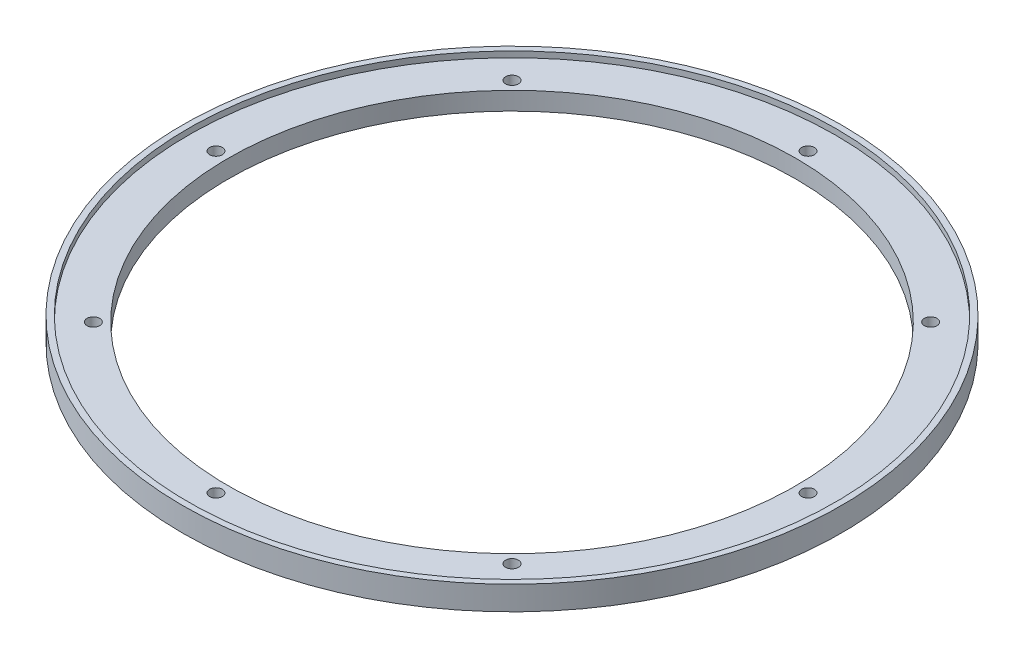
ISO-10303-21;
HEADER;
FILE_DESCRIPTION(('STEP AP214'),'2;1');
FILE_NAME('part.step','',(''),(''),'','','');
FILE_SCHEMA(('AUTOMOTIVE_DESIGN { 1 0 10303 214 1 1 1 1 }'));
ENDSEC;
DATA;
#1=APPLICATION_CONTEXT('core data for automotive mechanical design processes');
#2=APPLICATION_PROTOCOL_DEFINITION('international standard','automotive_design',2000,#1);
#3=PRODUCT_CONTEXT('',#1,'mechanical');
#4=PRODUCT('Part','Part','',(#3));
#5=PRODUCT_RELATED_PRODUCT_CATEGORY('part','',(#4));
#6=PRODUCT_DEFINITION_FORMATION('','',#4);
#7=PRODUCT_DEFINITION_CONTEXT('part definition',#1,'design');
#8=PRODUCT_DEFINITION('design','',#6,#7);
#9=PRODUCT_DEFINITION_SHAPE('','',#8);
#10=(LENGTH_UNIT() NAMED_UNIT(*) SI_UNIT(.MILLI.,.METRE.));
#11=(NAMED_UNIT(*) PLANE_ANGLE_UNIT() SI_UNIT($,.RADIAN.));
#12=(NAMED_UNIT(*) SI_UNIT($,.STERADIAN.) SOLID_ANGLE_UNIT());
#13=UNCERTAINTY_MEASURE_WITH_UNIT(LENGTH_MEASURE(1.E-05),#10,'distance_accuracy_value','');
#14=(GEOMETRIC_REPRESENTATION_CONTEXT(3) GLOBAL_UNCERTAINTY_ASSIGNED_CONTEXT((#13)) GLOBAL_UNIT_ASSIGNED_CONTEXT((#10,
#11,#12)) REPRESENTATION_CONTEXT('',''));
#15=CARTESIAN_POINT('',(0.,0.,0.));
#16=DIRECTION('',(0.,0.,1.));
#17=DIRECTION('',(1.,0.,0.));
#18=AXIS2_PLACEMENT_3D('',#15,#16,#17);
#19=CARTESIAN_POINT('',(0.,0.,0.));
#20=DIRECTION('',(0.,-1.,0.));
#21=DIRECTION('',(0.,0.,-1.));
#22=AXIS2_PLACEMENT_3D('',#19,#20,#21);
#23=CYLINDRICAL_SURFACE('',#22,96.1);
#24=CARTESIAN_POINT('',(0.,0.,0.));
#25=DIRECTION('',(0.,-1.,0.));
#26=DIRECTION('',(0.,0.,-1.));
#27=AXIS2_PLACEMENT_3D('',#24,#25,#26);
#28=CIRCLE('',#27,96.1);
#29=CARTESIAN_POINT('',(0.,0.,-96.1));
#30=VERTEX_POINT('',#29);
#31=EDGE_CURVE('E10',#30,#30,#28,.T.);
#32=ORIENTED_EDGE('',*,*,#31,.T.);
#33=EDGE_LOOP('',(#32));
#34=FACE_BOUND('',#33,.T.);
#35=CARTESIAN_POINT('',(0.,6.1,0.));
#36=DIRECTION('',(0.,-1.,0.));
#37=DIRECTION('',(0.,0.,-1.));
#38=AXIS2_PLACEMENT_3D('',#35,#36,#37);
#39=CIRCLE('',#38,96.1);
#40=CARTESIAN_POINT('',(0.,6.1,-96.1));
#41=VERTEX_POINT('',#40);
#42=EDGE_CURVE('E60',#41,#41,#39,.T.);
#43=ORIENTED_EDGE('',*,*,#42,.F.);
#44=EDGE_LOOP('',(#43));
#45=FACE_BOUND('',#44,.T.);
#46=ADVANCED_FACE('F38',(#34,#45),#23,.F.);
#47=CARTESIAN_POINT('',(96.1,0.,0.));
#48=DIRECTION('',(0.,-1.,0.));
#49=DIRECTION('',(0.,0.,-1.));
#50=AXIS2_PLACEMENT_3D('',#47,#48,#49);
#51=PLANE('',#50);
#52=CARTESIAN_POINT('',(-100.25,0.,0.));
#53=DIRECTION('',(0.,-1.,0.));
#54=DIRECTION('',(0.,0.,-1.));
#55=AXIS2_PLACEMENT_3D('',#52,#53,#54);
#56=CIRCLE('',#55,2.15);
#57=CARTESIAN_POINT('',(-100.25,0.,-2.15));
#58=VERTEX_POINT('',#57);
#59=EDGE_CURVE('E106',#58,#58,#56,.F.);
#60=ORIENTED_EDGE('',*,*,#59,.T.);
#61=EDGE_LOOP('',(#60));
#62=FACE_BOUND('',#61,.T.);
#63=CARTESIAN_POINT('',(-70.8874548139513,0.,-70.8874548139515));
#64=DIRECTION('',(0.,-1.,0.));
#65=DIRECTION('',(0.,0.,-1.));
#66=AXIS2_PLACEMENT_3D('',#63,#64,#65);
#67=CIRCLE('',#66,2.15);
#68=CARTESIAN_POINT('',(-70.8874548139513,0.,-73.0374548139515));
#69=VERTEX_POINT('',#68);
#70=EDGE_CURVE('E103',#69,#69,#67,.F.);
#71=ORIENTED_EDGE('',*,*,#70,.T.);
#72=EDGE_LOOP('',(#71));
#73=FACE_BOUND('',#72,.T.);
#74=CARTESIAN_POINT('',(3.26928365306821E-13,0.,-100.25));
#75=DIRECTION('',(0.,-1.,0.));
#76=DIRECTION('',(0.,0.,-1.));
#77=AXIS2_PLACEMENT_3D('',#74,#75,#76);
#78=CIRCLE('',#77,2.15);
#79=CARTESIAN_POINT('',(3.26928365306821E-13,0.,-102.4));
#80=VERTEX_POINT('',#79);
#81=EDGE_CURVE('E97',#80,#80,#78,.F.);
#82=ORIENTED_EDGE('',*,*,#81,.T.);
#83=EDGE_LOOP('',(#82));
#84=FACE_BOUND('',#83,.T.);
#85=CARTESIAN_POINT('',(70.8874548139518,0.,-70.8874548139514));
#86=DIRECTION('',(0.,-1.,0.));
#87=DIRECTION('',(0.,0.,-1.));
#88=AXIS2_PLACEMENT_3D('',#85,#86,#87);
#89=CIRCLE('',#88,2.15);
#90=CARTESIAN_POINT('',(70.8874548139518,0.,-73.0374548139514));
#91=VERTEX_POINT('',#90);
#92=EDGE_CURVE('E91',#91,#91,#89,.F.);
#93=ORIENTED_EDGE('',*,*,#92,.T.);
#94=EDGE_LOOP('',(#93));
#95=FACE_BOUND('',#94,.T.);
#96=CARTESIAN_POINT('',(100.25,0.,1.8201194514795E-13));
#97=DIRECTION('',(0.,-1.,0.));
#98=DIRECTION('',(0.,0.,-1.));
#99=AXIS2_PLACEMENT_3D('',#96,#97,#98);
#100=CIRCLE('',#99,2.15);
#101=CARTESIAN_POINT('',(100.25,0.,-2.14999999999982));
#102=VERTEX_POINT('',#101);
#103=EDGE_CURVE('E85',#102,#102,#100,.F.);
#104=ORIENTED_EDGE('',*,*,#103,.T.);
#105=EDGE_LOOP('',(#104));
#106=FACE_BOUND('',#105,.T.);
#107=CARTESIAN_POINT('',(70.8874548139517,0.,70.8874548139517));
#108=DIRECTION('',(0.,-1.,0.));
#109=DIRECTION('',(0.,0.,-1.));
#110=AXIS2_PLACEMENT_3D('',#107,#108,#109);
#111=CIRCLE('',#110,2.15);
#112=CARTESIAN_POINT('',(70.8874548139517,0.,68.7374548139517));
#113=VERTEX_POINT('',#112);
#114=EDGE_CURVE('E79',#113,#113,#111,.F.);
#115=ORIENTED_EDGE('',*,*,#114,.T.);
#116=EDGE_LOOP('',(#115));
#117=FACE_BOUND('',#116,.T.);
#118=CARTESIAN_POINT('',(1.57193504320323E-13,0.,100.25));
#119=DIRECTION('',(0.,-1.,0.));
#120=DIRECTION('',(0.,0.,-1.));
#121=AXIS2_PLACEMENT_3D('',#118,#119,#120);
#122=CIRCLE('',#121,2.14999999999999);
#123=CARTESIAN_POINT('',(1.57193504320323E-13,0.,98.1000000000003));
#124=VERTEX_POINT('',#123);
#125=EDGE_CURVE('E73',#124,#124,#122,.F.);
#126=ORIENTED_EDGE('',*,*,#125,.T.);
#127=EDGE_LOOP('',(#126));
#128=FACE_BOUND('',#127,.T.);
#129=CARTESIAN_POINT('',(-70.8874548139514,0.,70.8874548139516));
#130=DIRECTION('',(0.,-1.,0.));
#131=DIRECTION('',(0.,0.,-1.));
#132=AXIS2_PLACEMENT_3D('',#129,#130,#131);
#133=CIRCLE('',#132,2.15);
#134=CARTESIAN_POINT('',(-70.8874548139514,0.,68.7374548139516));
#135=VERTEX_POINT('',#134);
#136=EDGE_CURVE('E67',#135,#135,#133,.F.);
#137=ORIENTED_EDGE('',*,*,#136,.T.);
#138=EDGE_LOOP('',(#137));
#139=FACE_BOUND('',#138,.T.);
#140=CARTESIAN_POINT('',(0.,0.,0.));
#141=DIRECTION('',(0.,-1.,0.));
#142=DIRECTION('',(0.,0.,-1.));
#143=AXIS2_PLACEMENT_3D('',#140,#141,#142);
#144=CIRCLE('',#143,111.6);
#145=CARTESIAN_POINT('',(0.,0.,-111.6));
#146=VERTEX_POINT('',#145);
#147=EDGE_CURVE('E44',#146,#146,#144,.T.);
#148=ORIENTED_EDGE('',*,*,#147,.T.);
#149=EDGE_LOOP('',(#148));
#150=FACE_BOUND('',#149,.T.);
#151=ORIENTED_EDGE('',*,*,#31,.F.);
#152=EDGE_LOOP('',(#151));
#153=FACE_BOUND('',#152,.T.);
#154=ADVANCED_FACE('F152',(#62,#73,#84,#95,#106,#117,#128,#139,#150,#153),#51,.T.);
#155=CARTESIAN_POINT('',(0.,0.,0.));
#156=DIRECTION('',(0.,-1.,0.));
#157=DIRECTION('',(0.,0.,-1.));
#158=AXIS2_PLACEMENT_3D('',#155,#156,#157);
#159=CYLINDRICAL_SURFACE('',#158,111.6);
#160=CARTESIAN_POINT('',(0.,8.1,0.));
#161=DIRECTION('',(0.,-1.,0.));
#162=DIRECTION('',(0.,0.,-1.));
#163=AXIS2_PLACEMENT_3D('',#160,#161,#162);
#164=CIRCLE('',#163,111.6);
#165=CARTESIAN_POINT('',(0.,8.1,-111.6));
#166=VERTEX_POINT('',#165);
#167=EDGE_CURVE('E48',#166,#166,#164,.T.);
#168=ORIENTED_EDGE('',*,*,#167,.T.);
#169=EDGE_LOOP('',(#168));
#170=FACE_BOUND('',#169,.T.);
#171=ORIENTED_EDGE('',*,*,#147,.F.);
#172=EDGE_LOOP('',(#171));
#173=FACE_BOUND('',#172,.T.);
#174=ADVANCED_FACE('F146',(#170,#173),#159,.T.);
#175=CARTESIAN_POINT('',(111.6,8.1,0.));
#176=DIRECTION('',(0.,1.,0.));
#177=DIRECTION('',(0.,0.,1.));
#178=AXIS2_PLACEMENT_3D('',#175,#176,#177);
#179=PLANE('',#178);
#180=CARTESIAN_POINT('',(0.,8.1,0.));
#181=DIRECTION('',(0.,-1.,0.));
#182=DIRECTION('',(0.,0.,-1.));
#183=AXIS2_PLACEMENT_3D('',#180,#181,#182);
#184=CIRCLE('',#183,109.6);
#185=CARTESIAN_POINT('',(0.,8.1,-109.6));
#186=VERTEX_POINT('',#185);
#187=EDGE_CURVE('E52',#186,#186,#184,.T.);
#188=ORIENTED_EDGE('',*,*,#187,.T.);
#189=EDGE_LOOP('',(#188));
#190=FACE_BOUND('',#189,.T.);
#191=ORIENTED_EDGE('',*,*,#167,.F.);
#192=EDGE_LOOP('',(#191));
#193=FACE_BOUND('',#192,.T.);
#194=ADVANCED_FACE('F140',(#190,#193),#179,.T.);
#195=CARTESIAN_POINT('',(0.,0.,0.));
#196=DIRECTION('',(0.,-1.,0.));
#197=DIRECTION('',(0.,0.,-1.));
#198=AXIS2_PLACEMENT_3D('',#195,#196,#197);
#199=CYLINDRICAL_SURFACE('',#198,109.6);
#200=CARTESIAN_POINT('',(0.,6.1,0.));
#201=DIRECTION('',(0.,-1.,0.));
#202=DIRECTION('',(0.,0.,-1.));
#203=AXIS2_PLACEMENT_3D('',#200,#201,#202);
#204=CIRCLE('',#203,109.6);
#205=CARTESIAN_POINT('',(0.,6.1,-109.6));
#206=VERTEX_POINT('',#205);
#207=EDGE_CURVE('E57',#206,#206,#204,.T.);
#208=ORIENTED_EDGE('',*,*,#207,.T.);
#209=EDGE_LOOP('',(#208));
#210=FACE_BOUND('',#209,.T.);
#211=ORIENTED_EDGE('',*,*,#187,.F.);
#212=EDGE_LOOP('',(#211));
#213=FACE_BOUND('',#212,.T.);
#214=ADVANCED_FACE('F118',(#210,#213),#199,.F.);
#215=CARTESIAN_POINT('',(96.1,6.1,0.));
#216=DIRECTION('',(0.,1.,0.));
#217=DIRECTION('',(0.,0.,1.));
#218=AXIS2_PLACEMENT_3D('',#215,#216,#217);
#219=PLANE('',#218);
#220=CARTESIAN_POINT('',(-100.25,6.1,0.));
#221=DIRECTION('',(0.,1.,0.));
#222=DIRECTION('',(0.,0.,1.));
#223=AXIS2_PLACEMENT_3D('',#220,#221,#222);
#224=CIRCLE('',#223,2.15);
#225=CARTESIAN_POINT('',(-100.25,6.1,2.15));
#226=VERTEX_POINT('',#225);
#227=EDGE_CURVE('E63',#226,#226,#224,.T.);
#228=ORIENTED_EDGE('',*,*,#227,.F.);
#229=EDGE_LOOP('',(#228));
#230=FACE_BOUND('',#229,.T.);
#231=CARTESIAN_POINT('',(-70.8874548139513,6.1,-70.8874548139515));
#232=DIRECTION('',(0.,1.,0.));
#233=DIRECTION('',(0.,0.,1.));
#234=AXIS2_PLACEMENT_3D('',#231,#232,#233);
#235=CIRCLE('',#234,2.15);
#236=CARTESIAN_POINT('',(-70.8874548139513,6.1,-68.7374548139515));
#237=VERTEX_POINT('',#236);
#238=EDGE_CURVE('E100',#237,#237,#235,.T.);
#239=ORIENTED_EDGE('',*,*,#238,.F.);
#240=EDGE_LOOP('',(#239));
#241=FACE_BOUND('',#240,.T.);
#242=CARTESIAN_POINT('',(3.26928365306821E-13,6.1,-100.25));
#243=DIRECTION('',(0.,1.,0.));
#244=DIRECTION('',(0.,0.,1.));
#245=AXIS2_PLACEMENT_3D('',#242,#243,#244);
#246=CIRCLE('',#245,2.15);
#247=CARTESIAN_POINT('',(3.26928365306821E-13,6.1,-98.1000000000002));
#248=VERTEX_POINT('',#247);
#249=EDGE_CURVE('E94',#248,#248,#246,.T.);
#250=ORIENTED_EDGE('',*,*,#249,.F.);
#251=EDGE_LOOP('',(#250));
#252=FACE_BOUND('',#251,.T.);
#253=CARTESIAN_POINT('',(70.8874548139518,6.1,-70.8874548139514));
#254=DIRECTION('',(0.,1.,0.));
#255=DIRECTION('',(0.,0.,1.));
#256=AXIS2_PLACEMENT_3D('',#253,#254,#255);
#257=CIRCLE('',#256,2.15);
#258=CARTESIAN_POINT('',(70.8874548139518,6.1,-68.7374548139514));
#259=VERTEX_POINT('',#258);
#260=EDGE_CURVE('E88',#259,#259,#257,.T.);
#261=ORIENTED_EDGE('',*,*,#260,.F.);
#262=EDGE_LOOP('',(#261));
#263=FACE_BOUND('',#262,.T.);
#264=CARTESIAN_POINT('',(100.25,6.1,1.8201194514795E-13));
#265=DIRECTION('',(0.,1.,0.));
#266=DIRECTION('',(0.,0.,1.));
#267=AXIS2_PLACEMENT_3D('',#264,#265,#266);
#268=CIRCLE('',#267,2.15);
#269=CARTESIAN_POINT('',(100.25,6.1,2.15000000000018));
#270=VERTEX_POINT('',#269);
#271=EDGE_CURVE('E82',#270,#270,#268,.T.);
#272=ORIENTED_EDGE('',*,*,#271,.F.);
#273=EDGE_LOOP('',(#272));
#274=FACE_BOUND('',#273,.T.);
#275=CARTESIAN_POINT('',(70.8874548139517,6.1,70.8874548139517));
#276=DIRECTION('',(0.,1.,0.));
#277=DIRECTION('',(0.,0.,1.));
#278=AXIS2_PLACEMENT_3D('',#275,#276,#277);
#279=CIRCLE('',#278,2.15);
#280=CARTESIAN_POINT('',(70.8874548139517,6.1,73.0374548139517));
#281=VERTEX_POINT('',#280);
#282=EDGE_CURVE('E76',#281,#281,#279,.T.);
#283=ORIENTED_EDGE('',*,*,#282,.F.);
#284=EDGE_LOOP('',(#283));
#285=FACE_BOUND('',#284,.T.);
#286=CARTESIAN_POINT('',(1.57193504320323E-13,6.1,100.25));
#287=DIRECTION('',(0.,1.,0.));
#288=DIRECTION('',(0.,0.,1.));
#289=AXIS2_PLACEMENT_3D('',#286,#287,#288);
#290=CIRCLE('',#289,2.14999999999999);
#291=CARTESIAN_POINT('',(1.57193504320323E-13,6.1,102.4));
#292=VERTEX_POINT('',#291);
#293=EDGE_CURVE('E70',#292,#292,#290,.T.);
#294=ORIENTED_EDGE('',*,*,#293,.F.);
#295=EDGE_LOOP('',(#294));
#296=FACE_BOUND('',#295,.T.);
#297=CARTESIAN_POINT('',(-70.8874548139514,6.1,70.8874548139516));
#298=DIRECTION('',(0.,1.,0.));
#299=DIRECTION('',(0.,0.,1.));
#300=AXIS2_PLACEMENT_3D('',#297,#298,#299);
#301=CIRCLE('',#300,2.15);
#302=CARTESIAN_POINT('',(-70.8874548139514,6.1,73.0374548139516));
#303=VERTEX_POINT('',#302);
#304=EDGE_CURVE('E64',#303,#303,#301,.T.);
#305=ORIENTED_EDGE('',*,*,#304,.F.);
#306=EDGE_LOOP('',(#305));
#307=FACE_BOUND('',#306,.T.);
#308=ORIENTED_EDGE('',*,*,#42,.T.);
#309=EDGE_LOOP('',(#308));
#310=FACE_BOUND('',#309,.T.);
#311=ORIENTED_EDGE('',*,*,#207,.F.);
#312=EDGE_LOOP('',(#311));
#313=FACE_BOUND('',#312,.T.);
#314=ADVANCED_FACE('F114',(#230,#241,#252,#263,#274,#285,#296,#307,#310,#313),#219,.T.);
#315=CARTESIAN_POINT('',(-70.8874548139514,-0.00100000000000013,70.8874548139516));
#316=DIRECTION('',(0.,1.,0.));
#317=DIRECTION('',(0.,0.,1.));
#318=AXIS2_PLACEMENT_3D('',#315,#316,#317);
#319=CYLINDRICAL_SURFACE('',#318,2.15);
#320=ORIENTED_EDGE('',*,*,#136,.F.);
#321=EDGE_LOOP('',(#320));
#322=FACE_BOUND('',#321,.T.);
#323=ORIENTED_EDGE('',*,*,#304,.T.);
#324=EDGE_LOOP('',(#323));
#325=FACE_BOUND('',#324,.T.);
#326=ADVANCED_FACE('F117',(#322,#325),#319,.F.);
#327=CARTESIAN_POINT('',(1.57193504320323E-13,-0.00100000000000013,100.25));
#328=DIRECTION('',(0.,1.,0.));
#329=DIRECTION('',(0.,0.,1.));
#330=AXIS2_PLACEMENT_3D('',#327,#328,#329);
#331=CYLINDRICAL_SURFACE('',#330,2.14999999999999);
#332=ORIENTED_EDGE('',*,*,#125,.F.);
#333=EDGE_LOOP('',(#332));
#334=FACE_BOUND('',#333,.T.);
#335=ORIENTED_EDGE('',*,*,#293,.T.);
#336=EDGE_LOOP('',(#335));
#337=FACE_BOUND('',#336,.T.);
#338=ADVANCED_FACE('F203',(#334,#337),#331,.F.);
#339=CARTESIAN_POINT('',(70.8874548139517,-0.00100000000000013,70.8874548139517));
#340=DIRECTION('',(0.,1.,0.));
#341=DIRECTION('',(0.,0.,1.));
#342=AXIS2_PLACEMENT_3D('',#339,#340,#341);
#343=CYLINDRICAL_SURFACE('',#342,2.15);
#344=ORIENTED_EDGE('',*,*,#114,.F.);
#345=EDGE_LOOP('',(#344));
#346=FACE_BOUND('',#345,.T.);
#347=ORIENTED_EDGE('',*,*,#282,.T.);
#348=EDGE_LOOP('',(#347));
#349=FACE_BOUND('',#348,.T.);
#350=ADVANCED_FACE('F213',(#346,#349),#343,.F.);
#351=CARTESIAN_POINT('',(100.25,-0.00100000000000013,1.8201194514795E-13));
#352=DIRECTION('',(0.,1.,0.));
#353=DIRECTION('',(0.,0.,1.));
#354=AXIS2_PLACEMENT_3D('',#351,#352,#353);
#355=CYLINDRICAL_SURFACE('',#354,2.15);
#356=ORIENTED_EDGE('',*,*,#103,.F.);
#357=EDGE_LOOP('',(#356));
#358=FACE_BOUND('',#357,.T.);
#359=ORIENTED_EDGE('',*,*,#271,.T.);
#360=EDGE_LOOP('',(#359));
#361=FACE_BOUND('',#360,.T.);
#362=ADVANCED_FACE('F223',(#358,#361),#355,.F.);
#363=CARTESIAN_POINT('',(70.8874548139518,-0.00100000000000013,-70.8874548139514));
#364=DIRECTION('',(0.,1.,0.));
#365=DIRECTION('',(0.,0.,1.));
#366=AXIS2_PLACEMENT_3D('',#363,#364,#365);
#367=CYLINDRICAL_SURFACE('',#366,2.15);
#368=ORIENTED_EDGE('',*,*,#92,.F.);
#369=EDGE_LOOP('',(#368));
#370=FACE_BOUND('',#369,.T.);
#371=ORIENTED_EDGE('',*,*,#260,.T.);
#372=EDGE_LOOP('',(#371));
#373=FACE_BOUND('',#372,.T.);
#374=ADVANCED_FACE('F233',(#370,#373),#367,.F.);
#375=CARTESIAN_POINT('',(3.26928365306821E-13,-0.00100000000000013,-100.25));
#376=DIRECTION('',(0.,1.,0.));
#377=DIRECTION('',(0.,0.,1.));
#378=AXIS2_PLACEMENT_3D('',#375,#376,#377);
#379=CYLINDRICAL_SURFACE('',#378,2.15);
#380=ORIENTED_EDGE('',*,*,#81,.F.);
#381=EDGE_LOOP('',(#380));
#382=FACE_BOUND('',#381,.T.);
#383=ORIENTED_EDGE('',*,*,#249,.T.);
#384=EDGE_LOOP('',(#383));
#385=FACE_BOUND('',#384,.T.);
#386=ADVANCED_FACE('F243',(#382,#385),#379,.F.);
#387=CARTESIAN_POINT('',(-70.8874548139513,-0.00100000000000013,-70.8874548139515));
#388=DIRECTION('',(0.,1.,0.));
#389=DIRECTION('',(0.,0.,1.));
#390=AXIS2_PLACEMENT_3D('',#387,#388,#389);
#391=CYLINDRICAL_SURFACE('',#390,2.15);
#392=ORIENTED_EDGE('',*,*,#70,.F.);
#393=EDGE_LOOP('',(#392));
#394=FACE_BOUND('',#393,.T.);
#395=ORIENTED_EDGE('',*,*,#238,.T.);
#396=EDGE_LOOP('',(#395));
#397=FACE_BOUND('',#396,.T.);
#398=ADVANCED_FACE('F253',(#394,#397),#391,.F.);
#399=CARTESIAN_POINT('',(-100.25,-0.00100000000000013,0.));
#400=DIRECTION('',(0.,1.,0.));
#401=DIRECTION('',(0.,0.,1.));
#402=AXIS2_PLACEMENT_3D('',#399,#400,#401);
#403=CYLINDRICAL_SURFACE('',#402,2.15);
#404=ORIENTED_EDGE('',*,*,#59,.F.);
#405=EDGE_LOOP('',(#404));
#406=FACE_BOUND('',#405,.T.);
#407=ORIENTED_EDGE('',*,*,#227,.T.);
#408=EDGE_LOOP('',(#407));
#409=FACE_BOUND('',#408,.T.);
#410=ADVANCED_FACE('F112',(#406,#409),#403,.F.);
#411=CLOSED_SHELL('',(#46,#154,#174,#194,#214,#314,#326,#338,#350,#362,#374,#386,#398,#410));
#412=MANIFOLD_SOLID_BREP('B2',#411);
#413=ADVANCED_BREP_SHAPE_REPRESENTATION('',(#18,#412),#14);
#414=SHAPE_DEFINITION_REPRESENTATION(#9,#413);
ENDSEC;
END-ISO-10303-21;
